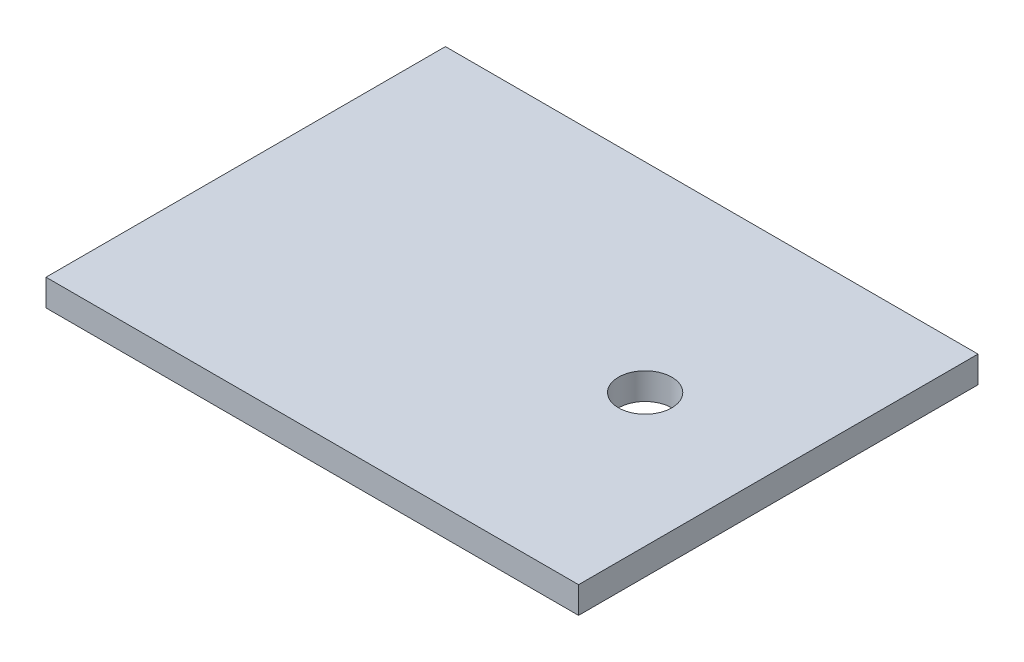
ISO-10303-21;
HEADER;
FILE_DESCRIPTION(('STEP AP214'),'2;1');
FILE_NAME('part.step','',(''),(''),'','','');
FILE_SCHEMA(('AUTOMOTIVE_DESIGN { 1 0 10303 214 1 1 1 1 }'));
ENDSEC;
DATA;
#1=APPLICATION_CONTEXT('core data for automotive mechanical design processes');
#2=APPLICATION_PROTOCOL_DEFINITION('international standard','automotive_design',2000,#1);
#3=PRODUCT_CONTEXT('',#1,'mechanical');
#4=PRODUCT('Part','Part','',(#3));
#5=PRODUCT_RELATED_PRODUCT_CATEGORY('part','',(#4));
#6=PRODUCT_DEFINITION_FORMATION('','',#4);
#7=PRODUCT_DEFINITION_CONTEXT('part definition',#1,'design');
#8=PRODUCT_DEFINITION('design','',#6,#7);
#9=PRODUCT_DEFINITION_SHAPE('','',#8);
#10=(LENGTH_UNIT() NAMED_UNIT(*) SI_UNIT(.MILLI.,.METRE.));
#11=(NAMED_UNIT(*) PLANE_ANGLE_UNIT() SI_UNIT($,.RADIAN.));
#12=(NAMED_UNIT(*) SI_UNIT($,.STERADIAN.) SOLID_ANGLE_UNIT());
#13=UNCERTAINTY_MEASURE_WITH_UNIT(LENGTH_MEASURE(1.E-05),#10,'distance_accuracy_value','');
#14=(GEOMETRIC_REPRESENTATION_CONTEXT(3) GLOBAL_UNCERTAINTY_ASSIGNED_CONTEXT((#13)) GLOBAL_UNIT_ASSIGNED_CONTEXT((#10,
#11,#12)) REPRESENTATION_CONTEXT('',''));
#15=CARTESIAN_POINT('',(0.,0.,0.));
#16=DIRECTION('',(0.,0.,1.));
#17=DIRECTION('',(1.,0.,0.));
#18=AXIS2_PLACEMENT_3D('',#15,#16,#17);
#19=CARTESIAN_POINT('',(100.,10.,-75.));
#20=DIRECTION('',(-1.,0.,0.));
#21=DIRECTION('',(0.,0.,1.));
#22=AXIS2_PLACEMENT_3D('',#19,#20,#21);
#23=PLANE('',#22);
#24=DIRECTION('',(0.,0.,-1.));
#25=VECTOR('',#24,1.);
#26=CARTESIAN_POINT('',(100.,0.,-75.));
#27=LINE('',#26,#25);
#28=CARTESIAN_POINT('',(100.,0.,75.));
#29=VERTEX_POINT('',#28);
#30=CARTESIAN_POINT('',(100.,0.,-75.));
#31=VERTEX_POINT('',#30);
#32=EDGE_CURVE('E115',#29,#31,#27,.T.);
#33=ORIENTED_EDGE('',*,*,#32,.T.);
#34=DIRECTION('',(0.,-1.,0.));
#35=VECTOR('',#34,1.);
#36=CARTESIAN_POINT('',(100.,10.,-75.));
#37=LINE('',#36,#35);
#38=CARTESIAN_POINT('',(100.,10.,-75.));
#39=VERTEX_POINT('',#38);
#40=EDGE_CURVE('E11',#39,#31,#37,.T.);
#41=ORIENTED_EDGE('',*,*,#40,.F.);
#42=DIRECTION('',(0.,0.,-1.));
#43=VECTOR('',#42,1.);
#44=CARTESIAN_POINT('',(100.,10.,-75.));
#45=LINE('',#44,#43);
#46=CARTESIAN_POINT('',(100.,10.,75.));
#47=VERTEX_POINT('',#46);
#48=EDGE_CURVE('E98',#47,#39,#45,.T.);
#49=ORIENTED_EDGE('',*,*,#48,.F.);
#50=DIRECTION('',(0.,-1.,0.));
#51=VECTOR('',#50,1.);
#52=CARTESIAN_POINT('',(100.,10.,75.));
#53=LINE('',#52,#51);
#54=EDGE_CURVE('E111',#47,#29,#53,.T.);
#55=ORIENTED_EDGE('',*,*,#54,.T.);
#56=EDGE_LOOP('',(#33,#41,#49,#55));
#57=FACE_BOUND('',#56,.T.);
#58=ADVANCED_FACE('F45',(#57),#23,.F.);
#59=CARTESIAN_POINT('',(-100.,10.,-75.));
#60=DIRECTION('',(0.,0.,1.));
#61=DIRECTION('',(1.,0.,0.));
#62=AXIS2_PLACEMENT_3D('',#59,#60,#61);
#63=PLANE('',#62);
#64=DIRECTION('',(-1.,0.,0.));
#65=VECTOR('',#64,1.);
#66=CARTESIAN_POINT('',(-100.,0.,-75.));
#67=LINE('',#66,#65);
#68=CARTESIAN_POINT('',(-100.,0.,-75.));
#69=VERTEX_POINT('',#68);
#70=EDGE_CURVE('E103',#31,#69,#67,.T.);
#71=ORIENTED_EDGE('',*,*,#70,.T.);
#72=DIRECTION('',(0.,-1.,0.));
#73=VECTOR('',#72,1.);
#74=CARTESIAN_POINT('',(-100.,10.,-75.));
#75=LINE('',#74,#73);
#76=CARTESIAN_POINT('',(-100.,10.,-75.));
#77=VERTEX_POINT('',#76);
#78=EDGE_CURVE('E55',#77,#69,#75,.T.);
#79=ORIENTED_EDGE('',*,*,#78,.F.);
#80=DIRECTION('',(-1.,0.,0.));
#81=VECTOR('',#80,1.);
#82=CARTESIAN_POINT('',(-100.,10.,-75.));
#83=LINE('',#82,#81);
#84=EDGE_CURVE('E93',#39,#77,#83,.T.);
#85=ORIENTED_EDGE('',*,*,#84,.F.);
#86=ORIENTED_EDGE('',*,*,#40,.T.);
#87=EDGE_LOOP('',(#71,#79,#85,#86));
#88=FACE_BOUND('',#87,.T.);
#89=ADVANCED_FACE('F102',(#88),#63,.F.);
#90=CARTESIAN_POINT('',(-100.,10.,-75.));
#91=DIRECTION('',(1.,0.,0.));
#92=DIRECTION('',(0.,0.,-1.));
#93=AXIS2_PLACEMENT_3D('',#90,#91,#92);
#94=PLANE('',#93);
#95=DIRECTION('',(0.,0.,1.));
#96=VECTOR('',#95,1.);
#97=CARTESIAN_POINT('',(-100.,0.,-75.));
#98=LINE('',#97,#96);
#99=CARTESIAN_POINT('',(-100.,0.,75.));
#100=VERTEX_POINT('',#99);
#101=EDGE_CURVE('E80',#69,#100,#98,.T.);
#102=ORIENTED_EDGE('',*,*,#101,.T.);
#103=DIRECTION('',(0.,-1.,0.));
#104=VECTOR('',#103,1.);
#105=CARTESIAN_POINT('',(-100.,10.,75.));
#106=LINE('',#105,#104);
#107=CARTESIAN_POINT('',(-100.,10.,75.));
#108=VERTEX_POINT('',#107);
#109=EDGE_CURVE('E105',#108,#100,#106,.T.);
#110=ORIENTED_EDGE('',*,*,#109,.F.);
#111=DIRECTION('',(0.,0.,1.));
#112=VECTOR('',#111,1.);
#113=CARTESIAN_POINT('',(-100.,10.,-75.));
#114=LINE('',#113,#112);
#115=EDGE_CURVE('E96',#77,#108,#114,.T.);
#116=ORIENTED_EDGE('',*,*,#115,.F.);
#117=ORIENTED_EDGE('',*,*,#78,.T.);
#118=EDGE_LOOP('',(#102,#110,#116,#117));
#119=FACE_BOUND('',#118,.T.);
#120=ADVANCED_FACE('F107',(#119),#94,.F.);
#121=CARTESIAN_POINT('',(-100.,10.,75.));
#122=DIRECTION('',(0.,0.,-1.));
#123=DIRECTION('',(-1.,0.,0.));
#124=AXIS2_PLACEMENT_3D('',#121,#122,#123);
#125=PLANE('',#124);
#126=DIRECTION('',(1.,0.,0.));
#127=VECTOR('',#126,1.);
#128=CARTESIAN_POINT('',(-100.,0.,75.));
#129=LINE('',#128,#127);
#130=EDGE_CURVE('E86',#100,#29,#129,.T.);
#131=ORIENTED_EDGE('',*,*,#130,.T.);
#132=ORIENTED_EDGE('',*,*,#54,.F.);
#133=DIRECTION('',(1.,0.,0.));
#134=VECTOR('',#133,1.);
#135=CARTESIAN_POINT('',(-100.,10.,75.));
#136=LINE('',#135,#134);
#137=EDGE_CURVE('E63',#108,#47,#136,.T.);
#138=ORIENTED_EDGE('',*,*,#137,.F.);
#139=ORIENTED_EDGE('',*,*,#109,.T.);
#140=EDGE_LOOP('',(#131,#132,#138,#139));
#141=FACE_BOUND('',#140,.T.);
#142=ADVANCED_FACE('F128',(#141),#125,.F.);
#143=CARTESIAN_POINT('',(0.,10.,0.));
#144=DIRECTION('',(0.,1.,0.));
#145=DIRECTION('',(0.,0.,1.));
#146=AXIS2_PLACEMENT_3D('',#143,#144,#145);
#147=PLANE('',#146);
#148=CARTESIAN_POINT('',(50.,10.,0.));
#149=DIRECTION('',(0.,1.,0.));
#150=DIRECTION('',(0.,0.,1.));
#151=AXIS2_PLACEMENT_3D('',#148,#149,#150);
#152=CIRCLE('',#151,9.99999999999999);
#153=CARTESIAN_POINT('',(50.,10.,10.));
#154=VERTEX_POINT('',#153);
#155=EDGE_CURVE('E135',#154,#154,#152,.T.);
#156=ORIENTED_EDGE('',*,*,#155,.F.);
#157=EDGE_LOOP('',(#156));
#158=FACE_BOUND('',#157,.T.);
#159=ORIENTED_EDGE('',*,*,#48,.T.);
#160=ORIENTED_EDGE('',*,*,#84,.T.);
#161=ORIENTED_EDGE('',*,*,#115,.T.);
#162=ORIENTED_EDGE('',*,*,#137,.T.);
#163=EDGE_LOOP('',(#159,#160,#161,#162));
#164=FACE_BOUND('',#163,.T.);
#165=ADVANCED_FACE('F94',(#158,#164),#147,.T.);
#166=CARTESIAN_POINT('',(0.,0.,0.));
#167=DIRECTION('',(0.,1.,0.));
#168=DIRECTION('',(0.,0.,1.));
#169=AXIS2_PLACEMENT_3D('',#166,#167,#168);
#170=PLANE('',#169);
#171=CARTESIAN_POINT('',(50.,0.,0.));
#172=DIRECTION('',(0.,1.,0.));
#173=DIRECTION('',(0.,0.,1.));
#174=AXIS2_PLACEMENT_3D('',#171,#172,#173);
#175=CIRCLE('',#174,9.99999999999999);
#176=CARTESIAN_POINT('',(50.,0.,10.));
#177=VERTEX_POINT('',#176);
#178=EDGE_CURVE('E48',#177,#177,#175,.T.);
#179=ORIENTED_EDGE('',*,*,#178,.T.);
#180=EDGE_LOOP('',(#179));
#181=FACE_BOUND('',#180,.T.);
#182=ORIENTED_EDGE('',*,*,#32,.F.);
#183=ORIENTED_EDGE('',*,*,#130,.F.);
#184=ORIENTED_EDGE('',*,*,#101,.F.);
#185=ORIENTED_EDGE('',*,*,#70,.F.);
#186=EDGE_LOOP('',(#182,#183,#184,#185));
#187=FACE_BOUND('',#186,.T.);
#188=ADVANCED_FACE('F131',(#181,#187),#170,.F.);
#189=CARTESIAN_POINT('',(50.,-10.,0.));
#190=DIRECTION('',(0.,1.,0.));
#191=DIRECTION('',(0.,0.,1.));
#192=AXIS2_PLACEMENT_3D('',#189,#190,#191);
#193=CYLINDRICAL_SURFACE('',#192,9.99999999999999);
#194=ORIENTED_EDGE('',*,*,#155,.T.);
#195=EDGE_LOOP('',(#194));
#196=FACE_BOUND('',#195,.T.);
#197=ORIENTED_EDGE('',*,*,#178,.F.);
#198=EDGE_LOOP('',(#197));
#199=FACE_BOUND('',#198,.T.);
#200=ADVANCED_FACE('F145',(#196,#199),#193,.F.);
#201=CLOSED_SHELL('',(#58,#89,#120,#142,#165,#188,#200));
#202=MANIFOLD_SOLID_BREP('B2',#201);
#203=ADVANCED_BREP_SHAPE_REPRESENTATION('',(#18,#202),#14);
#204=SHAPE_DEFINITION_REPRESENTATION(#9,#203);
ENDSEC;
END-ISO-10303-21;
